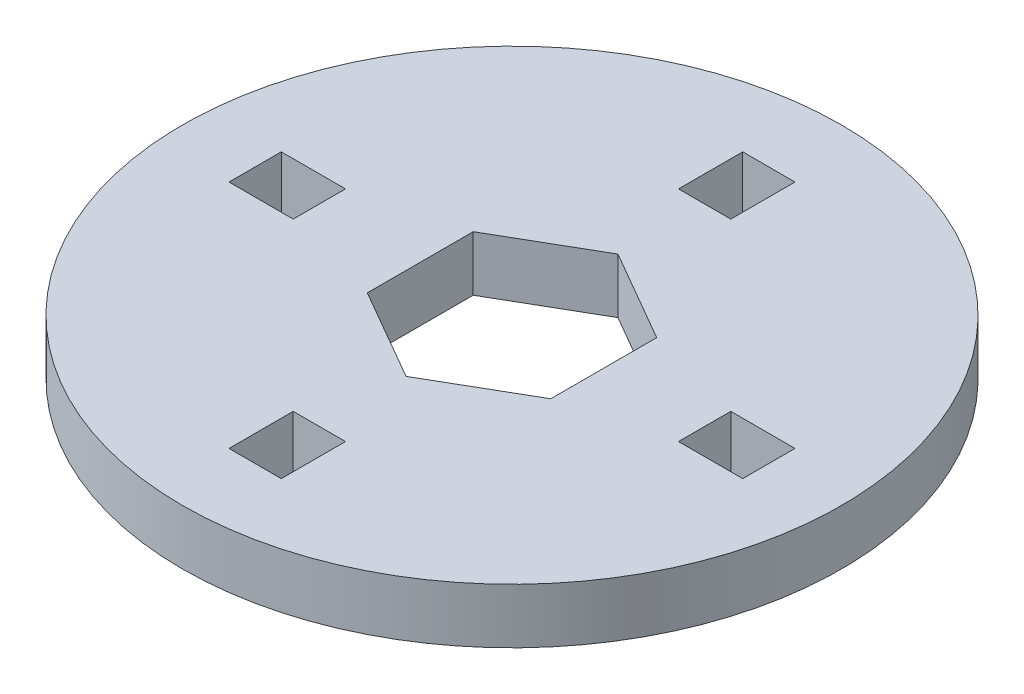
ISO-10303-21;
HEADER;
FILE_DESCRIPTION(('STEP AP214'),'2;1');
FILE_NAME('part.step','',(''),(''),'','','');
FILE_SCHEMA(('AUTOMOTIVE_DESIGN { 1 0 10303 214 1 1 1 1 }'));
ENDSEC;
DATA;
#1=APPLICATION_CONTEXT('core data for automotive mechanical design processes');
#2=APPLICATION_PROTOCOL_DEFINITION('international standard','automotive_design',2000,#1);
#3=PRODUCT_CONTEXT('',#1,'mechanical');
#4=PRODUCT('Part','Part','',(#3));
#5=PRODUCT_RELATED_PRODUCT_CATEGORY('part','',(#4));
#6=PRODUCT_DEFINITION_FORMATION('','',#4);
#7=PRODUCT_DEFINITION_CONTEXT('part definition',#1,'design');
#8=PRODUCT_DEFINITION('design','',#6,#7);
#9=PRODUCT_DEFINITION_SHAPE('','',#8);
#10=(LENGTH_UNIT() NAMED_UNIT(*) SI_UNIT(.MILLI.,.METRE.));
#11=(NAMED_UNIT(*) PLANE_ANGLE_UNIT() SI_UNIT($,.RADIAN.));
#12=(NAMED_UNIT(*) SI_UNIT($,.STERADIAN.) SOLID_ANGLE_UNIT());
#13=UNCERTAINTY_MEASURE_WITH_UNIT(LENGTH_MEASURE(1.E-05),#10,'distance_accuracy_value','');
#14=(GEOMETRIC_REPRESENTATION_CONTEXT(3) GLOBAL_UNCERTAINTY_ASSIGNED_CONTEXT((#13)) GLOBAL_UNIT_ASSIGNED_CONTEXT((#10,
#11,#12)) REPRESENTATION_CONTEXT('',''));
#15=CARTESIAN_POINT('',(0.,0.,0.));
#16=DIRECTION('',(0.,0.,1.));
#17=DIRECTION('',(1.,0.,0.));
#18=AXIS2_PLACEMENT_3D('',#15,#16,#17);
#19=CARTESIAN_POINT('',(0.,3.,0.));
#20=DIRECTION('',(0.,1.,0.));
#21=DIRECTION('',(0.,0.,1.));
#22=AXIS2_PLACEMENT_3D('',#19,#20,#21);
#23=PLANE('',#22);
#24=CARTESIAN_POINT('',(0.,3.,0.));
#25=DIRECTION('',(0.,1.,0.));
#26=DIRECTION('',(0.,0.,1.));
#27=AXIS2_PLACEMENT_3D('',#24,#25,#26);
#28=CIRCLE('',#27,17.9627392120467);
#29=CARTESIAN_POINT('',(0.,3.,17.9627392120467));
#30=VERTEX_POINT('',#29);
#31=EDGE_CURVE('E11',#30,#30,#28,.T.);
#32=ORIENTED_EDGE('',*,*,#31,.T.);
#33=EDGE_LOOP('',(#32));
#34=FACE_BOUND('',#33,.T.);
#35=DIRECTION('',(1.,0.,0.));
#36=VECTOR('',#35,1.);
#37=CARTESIAN_POINT('',(-10.5,3.,1.425));
#38=LINE('',#37,#36);
#39=CARTESIAN_POINT('',(-14.,3.,1.425));
#40=VERTEX_POINT('',#39);
#41=CARTESIAN_POINT('',(-10.5,3.,1.425));
#42=VERTEX_POINT('',#41);
#43=EDGE_CURVE('E328',#40,#42,#38,.T.);
#44=ORIENTED_EDGE('',*,*,#43,.F.);
#45=DIRECTION('',(0.,0.,1.));
#46=VECTOR('',#45,1.);
#47=CARTESIAN_POINT('',(-14.,3.,1.425));
#48=LINE('',#47,#46);
#49=CARTESIAN_POINT('',(-14.,3.,-1.425));
#50=VERTEX_POINT('',#49);
#51=EDGE_CURVE('E326',#50,#40,#48,.T.);
#52=ORIENTED_EDGE('',*,*,#51,.F.);
#53=DIRECTION('',(-1.,0.,0.));
#54=VECTOR('',#53,1.);
#55=CARTESIAN_POINT('',(-10.5,3.,-1.425));
#56=LINE('',#55,#54);
#57=CARTESIAN_POINT('',(-10.5,3.,-1.425));
#58=VERTEX_POINT('',#57);
#59=EDGE_CURVE('E334',#58,#50,#56,.T.);
#60=ORIENTED_EDGE('',*,*,#59,.F.);
#61=DIRECTION('',(0.,0.,-1.));
#62=VECTOR('',#61,1.);
#63=CARTESIAN_POINT('',(-10.5,3.,1.425));
#64=LINE('',#63,#62);
#65=EDGE_CURVE('E331',#42,#58,#64,.T.);
#66=ORIENTED_EDGE('',*,*,#65,.F.);
#67=EDGE_LOOP('',(#44,#52,#60,#66));
#68=FACE_BOUND('',#67,.T.);
#69=DIRECTION('',(0.,0.,1.));
#70=VECTOR('',#69,1.);
#71=CARTESIAN_POINT('',(-1.425,3.,-10.5));
#72=LINE('',#71,#70);
#73=CARTESIAN_POINT('',(-1.425,3.,-14.));
#74=VERTEX_POINT('',#73);
#75=CARTESIAN_POINT('',(-1.425,3.,-10.5));
#76=VERTEX_POINT('',#75);
#77=EDGE_CURVE('E297',#74,#76,#72,.T.);
#78=ORIENTED_EDGE('',*,*,#77,.F.);
#79=DIRECTION('',(-1.,0.,0.));
#80=VECTOR('',#79,1.);
#81=CARTESIAN_POINT('',(-1.425,3.,-14.));
#82=LINE('',#81,#80);
#83=CARTESIAN_POINT('',(1.425,3.,-14.));
#84=VERTEX_POINT('',#83);
#85=EDGE_CURVE('E295',#84,#74,#82,.T.);
#86=ORIENTED_EDGE('',*,*,#85,.F.);
#87=DIRECTION('',(0.,0.,-1.));
#88=VECTOR('',#87,1.);
#89=CARTESIAN_POINT('',(1.425,3.,-10.5));
#90=LINE('',#89,#88);
#91=CARTESIAN_POINT('',(1.425,3.,-10.5));
#92=VERTEX_POINT('',#91);
#93=EDGE_CURVE('E303',#92,#84,#90,.T.);
#94=ORIENTED_EDGE('',*,*,#93,.F.);
#95=DIRECTION('',(1.,0.,0.));
#96=VECTOR('',#95,1.);
#97=CARTESIAN_POINT('',(-1.425,3.,-10.5));
#98=LINE('',#97,#96);
#99=EDGE_CURVE('E300',#76,#92,#98,.T.);
#100=ORIENTED_EDGE('',*,*,#99,.F.);
#101=EDGE_LOOP('',(#78,#86,#94,#100));
#102=FACE_BOUND('',#101,.T.);
#103=DIRECTION('',(1.,0.,0.));
#104=VECTOR('',#103,1.);
#105=CARTESIAN_POINT('',(1.425,3.,14.));
#106=LINE('',#105,#104);
#107=CARTESIAN_POINT('',(-1.425,3.,14.));
#108=VERTEX_POINT('',#107);
#109=CARTESIAN_POINT('',(1.425,3.,14.));
#110=VERTEX_POINT('',#109);
#111=EDGE_CURVE('E266',#108,#110,#106,.T.);
#112=ORIENTED_EDGE('',*,*,#111,.F.);
#113=DIRECTION('',(0.,0.,1.));
#114=VECTOR('',#113,1.);
#115=CARTESIAN_POINT('',(-1.425,3.,10.5));
#116=LINE('',#115,#114);
#117=CARTESIAN_POINT('',(-1.425,3.,10.5));
#118=VERTEX_POINT('',#117);
#119=EDGE_CURVE('E264',#118,#108,#116,.T.);
#120=ORIENTED_EDGE('',*,*,#119,.F.);
#121=DIRECTION('',(-1.,0.,0.));
#122=VECTOR('',#121,1.);
#123=CARTESIAN_POINT('',(1.425,3.,10.5));
#124=LINE('',#123,#122);
#125=CARTESIAN_POINT('',(1.425,3.,10.5));
#126=VERTEX_POINT('',#125);
#127=EDGE_CURVE('E272',#126,#118,#124,.T.);
#128=ORIENTED_EDGE('',*,*,#127,.F.);
#129=DIRECTION('',(0.,0.,-1.));
#130=VECTOR('',#129,1.);
#131=CARTESIAN_POINT('',(1.425,3.,10.5));
#132=LINE('',#131,#130);
#133=EDGE_CURVE('E269',#110,#126,#132,.T.);
#134=ORIENTED_EDGE('',*,*,#133,.F.);
#135=EDGE_LOOP('',(#112,#120,#128,#134));
#136=FACE_BOUND('',#135,.T.);
#137=DIRECTION('',(-1.,0.,0.));
#138=VECTOR('',#137,1.);
#139=CARTESIAN_POINT('',(10.5,3.,-1.425));
#140=LINE('',#139,#138);
#141=CARTESIAN_POINT('',(14.,3.,-1.425));
#142=VERTEX_POINT('',#141);
#143=CARTESIAN_POINT('',(10.5,3.,-1.425));
#144=VERTEX_POINT('',#143);
#145=EDGE_CURVE('E235',#142,#144,#140,.T.);
#146=ORIENTED_EDGE('',*,*,#145,.F.);
#147=DIRECTION('',(0.,0.,-1.));
#148=VECTOR('',#147,1.);
#149=CARTESIAN_POINT('',(14.,3.,-1.425));
#150=LINE('',#149,#148);
#151=CARTESIAN_POINT('',(14.,3.,1.425));
#152=VERTEX_POINT('',#151);
#153=EDGE_CURVE('E233',#152,#142,#150,.T.);
#154=ORIENTED_EDGE('',*,*,#153,.F.);
#155=DIRECTION('',(1.,0.,0.));
#156=VECTOR('',#155,1.);
#157=CARTESIAN_POINT('',(10.5,3.,1.425));
#158=LINE('',#157,#156);
#159=CARTESIAN_POINT('',(10.5,3.,1.425));
#160=VERTEX_POINT('',#159);
#161=EDGE_CURVE('E241',#160,#152,#158,.T.);
#162=ORIENTED_EDGE('',*,*,#161,.F.);
#163=DIRECTION('',(0.,0.,1.));
#164=VECTOR('',#163,1.);
#165=CARTESIAN_POINT('',(10.5,3.,-1.425));
#166=LINE('',#165,#164);
#167=EDGE_CURVE('E238',#144,#160,#166,.T.);
#168=ORIENTED_EDGE('',*,*,#167,.F.);
#169=EDGE_LOOP('',(#146,#154,#162,#168));
#170=FACE_BOUND('',#169,.T.);
#171=DIRECTION('',(0.866025403784439,0.,-0.5));
#172=VECTOR('',#171,1.);
#173=CARTESIAN_POINT('',(0.,3.,5.77350269189626));
#174=LINE('',#173,#172);
#175=CARTESIAN_POINT('',(0.,3.,5.77350269189626));
#176=VERTEX_POINT('',#175);
#177=CARTESIAN_POINT('',(5.,3.,2.88675134594813));
#178=VERTEX_POINT('',#177);
#179=EDGE_CURVE('E190',#176,#178,#174,.T.);
#180=ORIENTED_EDGE('',*,*,#179,.F.);
#181=DIRECTION('',(0.866025403784439,0.,0.5));
#182=VECTOR('',#181,1.);
#183=CARTESIAN_POINT('',(-5.,3.,2.88675134594813));
#184=LINE('',#183,#182);
#185=CARTESIAN_POINT('',(-5.,3.,2.88675134594813));
#186=VERTEX_POINT('',#185);
#187=EDGE_CURVE('E182',#186,#176,#184,.T.);
#188=ORIENTED_EDGE('',*,*,#187,.F.);
#189=DIRECTION('',(0.,0.,1.));
#190=VECTOR('',#189,1.);
#191=CARTESIAN_POINT('',(-5.,3.,-2.88675134594813));
#192=LINE('',#191,#190);
#193=CARTESIAN_POINT('',(-5.,3.,-2.88675134594813));
#194=VERTEX_POINT('',#193);
#195=EDGE_CURVE('E211',#194,#186,#192,.T.);
#196=ORIENTED_EDGE('',*,*,#195,.F.);
#197=DIRECTION('',(-0.866025403784438,0.,0.5));
#198=VECTOR('',#197,1.);
#199=CARTESIAN_POINT('',(0.,3.,-5.77350269189626));
#200=LINE('',#199,#198);
#201=CARTESIAN_POINT('',(0.,3.,-5.77350269189626));
#202=VERTEX_POINT('',#201);
#203=EDGE_CURVE('E209',#202,#194,#200,.T.);
#204=ORIENTED_EDGE('',*,*,#203,.F.);
#205=DIRECTION('',(-0.866025403784439,0.,-0.5));
#206=VECTOR('',#205,1.);
#207=CARTESIAN_POINT('',(5.,3.,-2.88675134594813));
#208=LINE('',#207,#206);
#209=CARTESIAN_POINT('',(5.,3.,-2.88675134594813));
#210=VERTEX_POINT('',#209);
#211=EDGE_CURVE('E205',#210,#202,#208,.T.);
#212=ORIENTED_EDGE('',*,*,#211,.F.);
#213=DIRECTION('',(0.,0.,-1.));
#214=VECTOR('',#213,1.);
#215=CARTESIAN_POINT('',(5.,3.,2.88675134594813));
#216=LINE('',#215,#214);
#217=EDGE_CURVE('E203',#178,#210,#216,.T.);
#218=ORIENTED_EDGE('',*,*,#217,.F.);
#219=EDGE_LOOP('',(#180,#188,#196,#204,#212,#218));
#220=FACE_BOUND('',#219,.T.);
#221=ADVANCED_FACE('F33',(#34,#68,#102,#136,#170,#220),#23,.T.);
#222=CARTESIAN_POINT('',(0.,0.,0.));
#223=DIRECTION('',(0.,1.,0.));
#224=DIRECTION('',(0.,0.,1.));
#225=AXIS2_PLACEMENT_3D('',#222,#223,#224);
#226=PLANE('',#225);
#227=DIRECTION('',(0.,0.,-1.));
#228=VECTOR('',#227,1.);
#229=CARTESIAN_POINT('',(14.,0.,-1.425));
#230=LINE('',#229,#228);
#231=CARTESIAN_POINT('',(14.,0.,1.425));
#232=VERTEX_POINT('',#231);
#233=CARTESIAN_POINT('',(14.,0.,-1.425));
#234=VERTEX_POINT('',#233);
#235=EDGE_CURVE('E198',#232,#234,#230,.T.);
#236=ORIENTED_EDGE('',*,*,#235,.T.);
#237=DIRECTION('',(-1.,0.,0.));
#238=VECTOR('',#237,1.);
#239=CARTESIAN_POINT('',(10.5,0.,-1.425));
#240=LINE('',#239,#238);
#241=CARTESIAN_POINT('',(10.5,0.,-1.425));
#242=VERTEX_POINT('',#241);
#243=EDGE_CURVE('E246',#234,#242,#240,.T.);
#244=ORIENTED_EDGE('',*,*,#243,.T.);
#245=DIRECTION('',(0.,0.,1.));
#246=VECTOR('',#245,1.);
#247=CARTESIAN_POINT('',(10.5,0.,-1.425));
#248=LINE('',#247,#246);
#249=CARTESIAN_POINT('',(10.5,0.,1.425));
#250=VERTEX_POINT('',#249);
#251=EDGE_CURVE('E249',#242,#250,#248,.T.);
#252=ORIENTED_EDGE('',*,*,#251,.T.);
#253=DIRECTION('',(1.,0.,0.));
#254=VECTOR('',#253,1.);
#255=CARTESIAN_POINT('',(10.5,0.,1.425));
#256=LINE('',#255,#254);
#257=EDGE_CURVE('E236',#250,#232,#256,.T.);
#258=ORIENTED_EDGE('',*,*,#257,.T.);
#259=EDGE_LOOP('',(#236,#244,#252,#258));
#260=FACE_BOUND('',#259,.T.);
#261=DIRECTION('',(-1.,0.,0.));
#262=VECTOR('',#261,1.);
#263=CARTESIAN_POINT('',(-1.425,0.,-14.));
#264=LINE('',#263,#262);
#265=CARTESIAN_POINT('',(1.425,0.,-14.));
#266=VERTEX_POINT('',#265);
#267=CARTESIAN_POINT('',(-1.425,0.,-14.));
#268=VERTEX_POINT('',#267);
#269=EDGE_CURVE('E294',#266,#268,#264,.T.);
#270=ORIENTED_EDGE('',*,*,#269,.T.);
#271=DIRECTION('',(0.,0.,1.));
#272=VECTOR('',#271,1.);
#273=CARTESIAN_POINT('',(-1.425,0.,-10.5));
#274=LINE('',#273,#272);
#275=CARTESIAN_POINT('',(-1.425,0.,-10.5));
#276=VERTEX_POINT('',#275);
#277=EDGE_CURVE('E308',#268,#276,#274,.T.);
#278=ORIENTED_EDGE('',*,*,#277,.T.);
#279=DIRECTION('',(1.,0.,0.));
#280=VECTOR('',#279,1.);
#281=CARTESIAN_POINT('',(-1.425,0.,-10.5));
#282=LINE('',#281,#280);
#283=CARTESIAN_POINT('',(1.425,0.,-10.5));
#284=VERTEX_POINT('',#283);
#285=EDGE_CURVE('E311',#276,#284,#282,.T.);
#286=ORIENTED_EDGE('',*,*,#285,.T.);
#287=DIRECTION('',(0.,0.,-1.));
#288=VECTOR('',#287,1.);
#289=CARTESIAN_POINT('',(1.425,0.,-10.5));
#290=LINE('',#289,#288);
#291=EDGE_CURVE('E298',#284,#266,#290,.T.);
#292=ORIENTED_EDGE('',*,*,#291,.T.);
#293=EDGE_LOOP('',(#270,#278,#286,#292));
#294=FACE_BOUND('',#293,.T.);
#295=CARTESIAN_POINT('',(0.,0.,0.));
#296=DIRECTION('',(0.,1.,0.));
#297=DIRECTION('',(0.,0.,1.));
#298=AXIS2_PLACEMENT_3D('',#295,#296,#297);
#299=CIRCLE('',#298,17.9627392120467);
#300=CARTESIAN_POINT('',(0.,0.,17.9627392120467));
#301=VERTEX_POINT('',#300);
#302=EDGE_CURVE('E37',#301,#301,#299,.T.);
#303=ORIENTED_EDGE('',*,*,#302,.F.);
#304=EDGE_LOOP('',(#303));
#305=FACE_BOUND('',#304,.T.);
#306=DIRECTION('',(0.,0.,1.));
#307=VECTOR('',#306,1.);
#308=CARTESIAN_POINT('',(-14.,0.,1.425));
#309=LINE('',#308,#307);
#310=CARTESIAN_POINT('',(-14.,0.,-1.425));
#311=VERTEX_POINT('',#310);
#312=CARTESIAN_POINT('',(-14.,0.,1.425));
#313=VERTEX_POINT('',#312);
#314=EDGE_CURVE('E325',#311,#313,#309,.T.);
#315=ORIENTED_EDGE('',*,*,#314,.T.);
#316=DIRECTION('',(1.,0.,0.));
#317=VECTOR('',#316,1.);
#318=CARTESIAN_POINT('',(-10.5,0.,1.425));
#319=LINE('',#318,#317);
#320=CARTESIAN_POINT('',(-10.5,0.,1.425));
#321=VERTEX_POINT('',#320);
#322=EDGE_CURVE('E339',#313,#321,#319,.T.);
#323=ORIENTED_EDGE('',*,*,#322,.T.);
#324=DIRECTION('',(0.,0.,-1.));
#325=VECTOR('',#324,1.);
#326=CARTESIAN_POINT('',(-10.5,0.,1.425));
#327=LINE('',#326,#325);
#328=CARTESIAN_POINT('',(-10.5,0.,-1.425));
#329=VERTEX_POINT('',#328);
#330=EDGE_CURVE('E342',#321,#329,#327,.T.);
#331=ORIENTED_EDGE('',*,*,#330,.T.);
#332=DIRECTION('',(-1.,0.,0.));
#333=VECTOR('',#332,1.);
#334=CARTESIAN_POINT('',(-10.5,0.,-1.425));
#335=LINE('',#334,#333);
#336=EDGE_CURVE('E329',#329,#311,#335,.T.);
#337=ORIENTED_EDGE('',*,*,#336,.T.);
#338=EDGE_LOOP('',(#315,#323,#331,#337));
#339=FACE_BOUND('',#338,.T.);
#340=DIRECTION('',(0.,0.,1.));
#341=VECTOR('',#340,1.);
#342=CARTESIAN_POINT('',(-1.425,0.,10.5));
#343=LINE('',#342,#341);
#344=CARTESIAN_POINT('',(-1.425,0.,10.5));
#345=VERTEX_POINT('',#344);
#346=CARTESIAN_POINT('',(-1.425,0.,14.));
#347=VERTEX_POINT('',#346);
#348=EDGE_CURVE('E263',#345,#347,#343,.T.);
#349=ORIENTED_EDGE('',*,*,#348,.T.);
#350=DIRECTION('',(1.,0.,0.));
#351=VECTOR('',#350,1.);
#352=CARTESIAN_POINT('',(1.425,0.,14.));
#353=LINE('',#352,#351);
#354=CARTESIAN_POINT('',(1.425,0.,14.));
#355=VERTEX_POINT('',#354);
#356=EDGE_CURVE('E277',#347,#355,#353,.T.);
#357=ORIENTED_EDGE('',*,*,#356,.T.);
#358=DIRECTION('',(0.,0.,-1.));
#359=VECTOR('',#358,1.);
#360=CARTESIAN_POINT('',(1.425,0.,10.5));
#361=LINE('',#360,#359);
#362=CARTESIAN_POINT('',(1.425,0.,10.5));
#363=VERTEX_POINT('',#362);
#364=EDGE_CURVE('E280',#355,#363,#361,.T.);
#365=ORIENTED_EDGE('',*,*,#364,.T.);
#366=DIRECTION('',(-1.,0.,0.));
#367=VECTOR('',#366,1.);
#368=CARTESIAN_POINT('',(1.425,0.,10.5));
#369=LINE('',#368,#367);
#370=EDGE_CURVE('E267',#363,#345,#369,.T.);
#371=ORIENTED_EDGE('',*,*,#370,.T.);
#372=EDGE_LOOP('',(#349,#357,#365,#371));
#373=FACE_BOUND('',#372,.T.);
#374=DIRECTION('',(0.866025403784439,0.,0.5));
#375=VECTOR('',#374,1.);
#376=CARTESIAN_POINT('',(-5.,0.,2.88675134594813));
#377=LINE('',#376,#375);
#378=CARTESIAN_POINT('',(-5.,0.,2.88675134594813));
#379=VERTEX_POINT('',#378);
#380=CARTESIAN_POINT('',(0.,0.,5.77350269189626));
#381=VERTEX_POINT('',#380);
#382=EDGE_CURVE('E56',#379,#381,#377,.T.);
#383=ORIENTED_EDGE('',*,*,#382,.T.);
#384=DIRECTION('',(0.866025403784439,0.,-0.5));
#385=VECTOR('',#384,1.);
#386=CARTESIAN_POINT('',(0.,0.,5.77350269189626));
#387=LINE('',#386,#385);
#388=CARTESIAN_POINT('',(5.,0.,2.88675134594813));
#389=VERTEX_POINT('',#388);
#390=EDGE_CURVE('E197',#381,#389,#387,.T.);
#391=ORIENTED_EDGE('',*,*,#390,.T.);
#392=DIRECTION('',(0.,0.,-1.));
#393=VECTOR('',#392,1.);
#394=CARTESIAN_POINT('',(5.,0.,2.88675134594813));
#395=LINE('',#394,#393);
#396=CARTESIAN_POINT('',(5.,0.,-2.88675134594813));
#397=VERTEX_POINT('',#396);
#398=EDGE_CURVE('E215',#389,#397,#395,.T.);
#399=ORIENTED_EDGE('',*,*,#398,.T.);
#400=DIRECTION('',(-0.866025403784439,0.,-0.5));
#401=VECTOR('',#400,1.);
#402=CARTESIAN_POINT('',(5.,0.,-2.88675134594813));
#403=LINE('',#402,#401);
#404=CARTESIAN_POINT('',(0.,0.,-5.77350269189626));
#405=VERTEX_POINT('',#404);
#406=EDGE_CURVE('E218',#397,#405,#403,.T.);
#407=ORIENTED_EDGE('',*,*,#406,.T.);
#408=DIRECTION('',(-0.866025403784438,0.,0.5));
#409=VECTOR('',#408,1.);
#410=CARTESIAN_POINT('',(0.,0.,-5.77350269189626));
#411=LINE('',#410,#409);
#412=CARTESIAN_POINT('',(-5.,0.,-2.88675134594813));
#413=VERTEX_POINT('',#412);
#414=EDGE_CURVE('E221',#405,#413,#411,.T.);
#415=ORIENTED_EDGE('',*,*,#414,.T.);
#416=DIRECTION('',(0.,0.,1.));
#417=VECTOR('',#416,1.);
#418=CARTESIAN_POINT('',(-5.,0.,-2.88675134594813));
#419=LINE('',#418,#417);
#420=EDGE_CURVE('E191',#413,#379,#419,.T.);
#421=ORIENTED_EDGE('',*,*,#420,.T.);
#422=EDGE_LOOP('',(#383,#391,#399,#407,#415,#421));
#423=FACE_BOUND('',#422,.T.);
#424=ADVANCED_FACE('F361',(#260,#294,#305,#339,#373,#423),#226,.F.);
#425=CARTESIAN_POINT('',(0.,3.,0.));
#426=DIRECTION('',(0.,-1.,0.));
#427=DIRECTION('',(0.,0.,-1.));
#428=AXIS2_PLACEMENT_3D('',#425,#426,#427);
#429=CYLINDRICAL_SURFACE('',#428,17.9627392120467);
#430=ORIENTED_EDGE('',*,*,#31,.F.);
#431=EDGE_LOOP('',(#430));
#432=FACE_BOUND('',#431,.T.);
#433=ORIENTED_EDGE('',*,*,#302,.T.);
#434=EDGE_LOOP('',(#433));
#435=FACE_BOUND('',#434,.T.);
#436=ADVANCED_FACE('F35',(#432,#435),#429,.T.);
#437=CARTESIAN_POINT('',(-14.,3.,1.425));
#438=DIRECTION('',(1.,0.,0.));
#439=DIRECTION('',(0.,0.,-1.));
#440=AXIS2_PLACEMENT_3D('',#437,#438,#439);
#441=PLANE('',#440);
#442=ORIENTED_EDGE('',*,*,#314,.F.);
#443=DIRECTION('',(0.,-1.,0.));
#444=VECTOR('',#443,1.);
#445=CARTESIAN_POINT('',(-14.,3.,-1.425));
#446=LINE('',#445,#444);
#447=EDGE_CURVE('E336',#50,#311,#446,.T.);
#448=ORIENTED_EDGE('',*,*,#447,.F.);
#449=ORIENTED_EDGE('',*,*,#51,.T.);
#450=DIRECTION('',(0.,-1.,0.));
#451=VECTOR('',#450,1.);
#452=CARTESIAN_POINT('',(-14.,3.,1.425));
#453=LINE('',#452,#451);
#454=EDGE_CURVE('E353',#40,#313,#453,.T.);
#455=ORIENTED_EDGE('',*,*,#454,.T.);
#456=EDGE_LOOP('',(#442,#448,#449,#455));
#457=FACE_BOUND('',#456,.T.);
#458=ADVANCED_FACE('F395',(#457),#441,.T.);
#459=CARTESIAN_POINT('',(-10.5,3.,1.425));
#460=DIRECTION('',(0.,0.,-1.));
#461=DIRECTION('',(-1.,0.,0.));
#462=AXIS2_PLACEMENT_3D('',#459,#460,#461);
#463=PLANE('',#462);
#464=ORIENTED_EDGE('',*,*,#322,.F.);
#465=ORIENTED_EDGE('',*,*,#454,.F.);
#466=ORIENTED_EDGE('',*,*,#43,.T.);
#467=DIRECTION('',(0.,-1.,0.));
#468=VECTOR('',#467,1.);
#469=CARTESIAN_POINT('',(-10.5,3.,1.425));
#470=LINE('',#469,#468);
#471=EDGE_CURVE('E351',#42,#321,#470,.T.);
#472=ORIENTED_EDGE('',*,*,#471,.T.);
#473=EDGE_LOOP('',(#464,#465,#466,#472));
#474=FACE_BOUND('',#473,.T.);
#475=ADVANCED_FACE('F398',(#474),#463,.T.);
#476=CARTESIAN_POINT('',(-10.5,3.,1.425));
#477=DIRECTION('',(-1.,0.,0.));
#478=DIRECTION('',(0.,0.,1.));
#479=AXIS2_PLACEMENT_3D('',#476,#477,#478);
#480=PLANE('',#479);
#481=ORIENTED_EDGE('',*,*,#330,.F.);
#482=ORIENTED_EDGE('',*,*,#471,.F.);
#483=ORIENTED_EDGE('',*,*,#65,.T.);
#484=DIRECTION('',(0.,-1.,0.));
#485=VECTOR('',#484,1.);
#486=CARTESIAN_POINT('',(-10.5,3.,-1.425));
#487=LINE('',#486,#485);
#488=EDGE_CURVE('E349',#58,#329,#487,.T.);
#489=ORIENTED_EDGE('',*,*,#488,.T.);
#490=EDGE_LOOP('',(#481,#482,#483,#489));
#491=FACE_BOUND('',#490,.T.);
#492=ADVANCED_FACE('F401',(#491),#480,.T.);
#493=CARTESIAN_POINT('',(-10.5,3.,-1.425));
#494=DIRECTION('',(0.,0.,1.));
#495=DIRECTION('',(1.,0.,0.));
#496=AXIS2_PLACEMENT_3D('',#493,#494,#495);
#497=PLANE('',#496);
#498=ORIENTED_EDGE('',*,*,#336,.F.);
#499=ORIENTED_EDGE('',*,*,#488,.F.);
#500=ORIENTED_EDGE('',*,*,#59,.T.);
#501=ORIENTED_EDGE('',*,*,#447,.T.);
#502=EDGE_LOOP('',(#498,#499,#500,#501));
#503=FACE_BOUND('',#502,.T.);
#504=ADVANCED_FACE('F405',(#503),#497,.T.);
#505=CARTESIAN_POINT('',(-1.425,3.,-14.));
#506=DIRECTION('',(0.,0.,1.));
#507=DIRECTION('',(1.,0.,0.));
#508=AXIS2_PLACEMENT_3D('',#505,#506,#507);
#509=PLANE('',#508);
#510=ORIENTED_EDGE('',*,*,#269,.F.);
#511=DIRECTION('',(0.,-1.,0.));
#512=VECTOR('',#511,1.);
#513=CARTESIAN_POINT('',(1.425,3.,-14.));
#514=LINE('',#513,#512);
#515=EDGE_CURVE('E305',#84,#266,#514,.T.);
#516=ORIENTED_EDGE('',*,*,#515,.F.);
#517=ORIENTED_EDGE('',*,*,#85,.T.);
#518=DIRECTION('',(0.,-1.,0.));
#519=VECTOR('',#518,1.);
#520=CARTESIAN_POINT('',(-1.425,3.,-14.));
#521=LINE('',#520,#519);
#522=EDGE_CURVE('E322',#74,#268,#521,.T.);
#523=ORIENTED_EDGE('',*,*,#522,.T.);
#524=EDGE_LOOP('',(#510,#516,#517,#523));
#525=FACE_BOUND('',#524,.T.);
#526=ADVANCED_FACE('F409',(#525),#509,.T.);
#527=CARTESIAN_POINT('',(-1.425,3.,-10.5));
#528=DIRECTION('',(1.,0.,0.));
#529=DIRECTION('',(0.,0.,-1.));
#530=AXIS2_PLACEMENT_3D('',#527,#528,#529);
#531=PLANE('',#530);
#532=ORIENTED_EDGE('',*,*,#277,.F.);
#533=ORIENTED_EDGE('',*,*,#522,.F.);
#534=ORIENTED_EDGE('',*,*,#77,.T.);
#535=DIRECTION('',(0.,-1.,0.));
#536=VECTOR('',#535,1.);
#537=CARTESIAN_POINT('',(-1.425,3.,-10.5));
#538=LINE('',#537,#536);
#539=EDGE_CURVE('E320',#76,#276,#538,.T.);
#540=ORIENTED_EDGE('',*,*,#539,.T.);
#541=EDGE_LOOP('',(#532,#533,#534,#540));
#542=FACE_BOUND('',#541,.T.);
#543=ADVANCED_FACE('F413',(#542),#531,.T.);
#544=CARTESIAN_POINT('',(-1.425,3.,-10.5));
#545=DIRECTION('',(0.,0.,-1.));
#546=DIRECTION('',(-1.,0.,0.));
#547=AXIS2_PLACEMENT_3D('',#544,#545,#546);
#548=PLANE('',#547);
#549=ORIENTED_EDGE('',*,*,#285,.F.);
#550=ORIENTED_EDGE('',*,*,#539,.F.);
#551=ORIENTED_EDGE('',*,*,#99,.T.);
#552=DIRECTION('',(0.,-1.,0.));
#553=VECTOR('',#552,1.);
#554=CARTESIAN_POINT('',(1.425,3.,-10.5));
#555=LINE('',#554,#553);
#556=EDGE_CURVE('E318',#92,#284,#555,.T.);
#557=ORIENTED_EDGE('',*,*,#556,.T.);
#558=EDGE_LOOP('',(#549,#550,#551,#557));
#559=FACE_BOUND('',#558,.T.);
#560=ADVANCED_FACE('F417',(#559),#548,.T.);
#561=CARTESIAN_POINT('',(1.425,3.,-10.5));
#562=DIRECTION('',(-1.,0.,0.));
#563=DIRECTION('',(0.,0.,1.));
#564=AXIS2_PLACEMENT_3D('',#561,#562,#563);
#565=PLANE('',#564);
#566=ORIENTED_EDGE('',*,*,#291,.F.);
#567=ORIENTED_EDGE('',*,*,#556,.F.);
#568=ORIENTED_EDGE('',*,*,#93,.T.);
#569=ORIENTED_EDGE('',*,*,#515,.T.);
#570=EDGE_LOOP('',(#566,#567,#568,#569));
#571=FACE_BOUND('',#570,.T.);
#572=ADVANCED_FACE('F421',(#571),#565,.T.);
#573=CARTESIAN_POINT('',(-1.425,3.,10.5));
#574=DIRECTION('',(1.,0.,0.));
#575=DIRECTION('',(0.,0.,-1.));
#576=AXIS2_PLACEMENT_3D('',#573,#574,#575);
#577=PLANE('',#576);
#578=ORIENTED_EDGE('',*,*,#348,.F.);
#579=DIRECTION('',(0.,-1.,0.));
#580=VECTOR('',#579,1.);
#581=CARTESIAN_POINT('',(-1.425,3.,10.5));
#582=LINE('',#581,#580);
#583=EDGE_CURVE('E274',#118,#345,#582,.T.);
#584=ORIENTED_EDGE('',*,*,#583,.F.);
#585=ORIENTED_EDGE('',*,*,#119,.T.);
#586=DIRECTION('',(0.,-1.,0.));
#587=VECTOR('',#586,1.);
#588=CARTESIAN_POINT('',(-1.425,3.,14.));
#589=LINE('',#588,#587);
#590=EDGE_CURVE('E291',#108,#347,#589,.T.);
#591=ORIENTED_EDGE('',*,*,#590,.T.);
#592=EDGE_LOOP('',(#578,#584,#585,#591));
#593=FACE_BOUND('',#592,.T.);
#594=ADVANCED_FACE('F425',(#593),#577,.T.);
#595=CARTESIAN_POINT('',(1.425,3.,14.));
#596=DIRECTION('',(0.,0.,-1.));
#597=DIRECTION('',(-1.,0.,0.));
#598=AXIS2_PLACEMENT_3D('',#595,#596,#597);
#599=PLANE('',#598);
#600=ORIENTED_EDGE('',*,*,#356,.F.);
#601=ORIENTED_EDGE('',*,*,#590,.F.);
#602=ORIENTED_EDGE('',*,*,#111,.T.);
#603=DIRECTION('',(0.,-1.,0.));
#604=VECTOR('',#603,1.);
#605=CARTESIAN_POINT('',(1.425,3.,14.));
#606=LINE('',#605,#604);
#607=EDGE_CURVE('E289',#110,#355,#606,.T.);
#608=ORIENTED_EDGE('',*,*,#607,.T.);
#609=EDGE_LOOP('',(#600,#601,#602,#608));
#610=FACE_BOUND('',#609,.T.);
#611=ADVANCED_FACE('F429',(#610),#599,.T.);
#612=CARTESIAN_POINT('',(1.425,3.,10.5));
#613=DIRECTION('',(-1.,0.,0.));
#614=DIRECTION('',(0.,0.,1.));
#615=AXIS2_PLACEMENT_3D('',#612,#613,#614);
#616=PLANE('',#615);
#617=ORIENTED_EDGE('',*,*,#364,.F.);
#618=ORIENTED_EDGE('',*,*,#607,.F.);
#619=ORIENTED_EDGE('',*,*,#133,.T.);
#620=DIRECTION('',(0.,-1.,0.));
#621=VECTOR('',#620,1.);
#622=CARTESIAN_POINT('',(1.425,3.,10.5));
#623=LINE('',#622,#621);
#624=EDGE_CURVE('E287',#126,#363,#623,.T.);
#625=ORIENTED_EDGE('',*,*,#624,.T.);
#626=EDGE_LOOP('',(#617,#618,#619,#625));
#627=FACE_BOUND('',#626,.T.);
#628=ADVANCED_FACE('F433',(#627),#616,.T.);
#629=CARTESIAN_POINT('',(1.425,3.,10.5));
#630=DIRECTION('',(0.,0.,1.));
#631=DIRECTION('',(1.,0.,0.));
#632=AXIS2_PLACEMENT_3D('',#629,#630,#631);
#633=PLANE('',#632);
#634=ORIENTED_EDGE('',*,*,#370,.F.);
#635=ORIENTED_EDGE('',*,*,#624,.F.);
#636=ORIENTED_EDGE('',*,*,#127,.T.);
#637=ORIENTED_EDGE('',*,*,#583,.T.);
#638=EDGE_LOOP('',(#634,#635,#636,#637));
#639=FACE_BOUND('',#638,.T.);
#640=ADVANCED_FACE('F437',(#639),#633,.T.);
#641=CARTESIAN_POINT('',(14.,3.,-1.425));
#642=DIRECTION('',(-1.,0.,0.));
#643=DIRECTION('',(0.,0.,1.));
#644=AXIS2_PLACEMENT_3D('',#641,#642,#643);
#645=PLANE('',#644);
#646=ORIENTED_EDGE('',*,*,#235,.F.);
#647=DIRECTION('',(0.,-1.,0.));
#648=VECTOR('',#647,1.);
#649=CARTESIAN_POINT('',(14.,3.,1.425));
#650=LINE('',#649,#648);
#651=EDGE_CURVE('E243',#152,#232,#650,.T.);
#652=ORIENTED_EDGE('',*,*,#651,.F.);
#653=ORIENTED_EDGE('',*,*,#153,.T.);
#654=DIRECTION('',(0.,-1.,0.));
#655=VECTOR('',#654,1.);
#656=CARTESIAN_POINT('',(14.,3.,-1.425));
#657=LINE('',#656,#655);
#658=EDGE_CURVE('E260',#142,#234,#657,.T.);
#659=ORIENTED_EDGE('',*,*,#658,.T.);
#660=EDGE_LOOP('',(#646,#652,#653,#659));
#661=FACE_BOUND('',#660,.T.);
#662=ADVANCED_FACE('F441',(#661),#645,.T.);
#663=CARTESIAN_POINT('',(10.5,3.,-1.425));
#664=DIRECTION('',(0.,0.,1.));
#665=DIRECTION('',(1.,0.,0.));
#666=AXIS2_PLACEMENT_3D('',#663,#664,#665);
#667=PLANE('',#666);
#668=ORIENTED_EDGE('',*,*,#243,.F.);
#669=ORIENTED_EDGE('',*,*,#658,.F.);
#670=ORIENTED_EDGE('',*,*,#145,.T.);
#671=DIRECTION('',(0.,-1.,0.));
#672=VECTOR('',#671,1.);
#673=CARTESIAN_POINT('',(10.5,3.,-1.425));
#674=LINE('',#673,#672);
#675=EDGE_CURVE('E258',#144,#242,#674,.T.);
#676=ORIENTED_EDGE('',*,*,#675,.T.);
#677=EDGE_LOOP('',(#668,#669,#670,#676));
#678=FACE_BOUND('',#677,.T.);
#679=ADVANCED_FACE('F445',(#678),#667,.T.);
#680=CARTESIAN_POINT('',(10.5,3.,-1.425));
#681=DIRECTION('',(1.,0.,0.));
#682=DIRECTION('',(0.,0.,-1.));
#683=AXIS2_PLACEMENT_3D('',#680,#681,#682);
#684=PLANE('',#683);
#685=ORIENTED_EDGE('',*,*,#251,.F.);
#686=ORIENTED_EDGE('',*,*,#675,.F.);
#687=ORIENTED_EDGE('',*,*,#167,.T.);
#688=DIRECTION('',(0.,-1.,0.));
#689=VECTOR('',#688,1.);
#690=CARTESIAN_POINT('',(10.5,3.,1.425));
#691=LINE('',#690,#689);
#692=EDGE_CURVE('E256',#160,#250,#691,.T.);
#693=ORIENTED_EDGE('',*,*,#692,.T.);
#694=EDGE_LOOP('',(#685,#686,#687,#693));
#695=FACE_BOUND('',#694,.T.);
#696=ADVANCED_FACE('F449',(#695),#684,.T.);
#697=CARTESIAN_POINT('',(10.5,3.,1.425));
#698=DIRECTION('',(0.,0.,-1.));
#699=DIRECTION('',(-1.,0.,0.));
#700=AXIS2_PLACEMENT_3D('',#697,#698,#699);
#701=PLANE('',#700);
#702=ORIENTED_EDGE('',*,*,#257,.F.);
#703=ORIENTED_EDGE('',*,*,#692,.F.);
#704=ORIENTED_EDGE('',*,*,#161,.T.);
#705=ORIENTED_EDGE('',*,*,#651,.T.);
#706=EDGE_LOOP('',(#702,#703,#704,#705));
#707=FACE_BOUND('',#706,.T.);
#708=ADVANCED_FACE('F453',(#707),#701,.T.);
#709=CARTESIAN_POINT('',(-5.,3.,2.88675134594813));
#710=DIRECTION('',(0.5,0.,-0.866025403784439));
#711=DIRECTION('',(-0.866025403784439,0.,-0.5));
#712=AXIS2_PLACEMENT_3D('',#709,#710,#711);
#713=PLANE('',#712);
#714=ORIENTED_EDGE('',*,*,#382,.F.);
#715=DIRECTION('',(0.,-1.,0.));
#716=VECTOR('',#715,1.);
#717=CARTESIAN_POINT('',(-5.,3.,2.88675134594813));
#718=LINE('',#717,#716);
#719=EDGE_CURVE('E186',#186,#379,#718,.T.);
#720=ORIENTED_EDGE('',*,*,#719,.F.);
#721=ORIENTED_EDGE('',*,*,#187,.T.);
#722=DIRECTION('',(0.,-1.,0.));
#723=VECTOR('',#722,1.);
#724=CARTESIAN_POINT('',(0.,3.,5.77350269189626));
#725=LINE('',#724,#723);
#726=EDGE_CURVE('E185',#176,#381,#725,.T.);
#727=ORIENTED_EDGE('',*,*,#726,.T.);
#728=EDGE_LOOP('',(#714,#720,#721,#727));
#729=FACE_BOUND('',#728,.T.);
#730=ADVANCED_FACE('F184',(#729),#713,.T.);
#731=CARTESIAN_POINT('',(0.,3.,5.77350269189626));
#732=DIRECTION('',(-0.5,0.,-0.866025403784439));
#733=DIRECTION('',(-0.866025403784439,0.,0.5));
#734=AXIS2_PLACEMENT_3D('',#731,#732,#733);
#735=PLANE('',#734);
#736=ORIENTED_EDGE('',*,*,#390,.F.);
#737=ORIENTED_EDGE('',*,*,#726,.F.);
#738=ORIENTED_EDGE('',*,*,#179,.T.);
#739=DIRECTION('',(0.,-1.,0.));
#740=VECTOR('',#739,1.);
#741=CARTESIAN_POINT('',(5.,3.,2.88675134594813));
#742=LINE('',#741,#740);
#743=EDGE_CURVE('E199',#178,#389,#742,.T.);
#744=ORIENTED_EDGE('',*,*,#743,.T.);
#745=EDGE_LOOP('',(#736,#737,#738,#744));
#746=FACE_BOUND('',#745,.T.);
#747=ADVANCED_FACE('F194',(#746),#735,.T.);
#748=CARTESIAN_POINT('',(5.,3.,2.88675134594813));
#749=DIRECTION('',(-1.,0.,0.));
#750=DIRECTION('',(0.,0.,1.));
#751=AXIS2_PLACEMENT_3D('',#748,#749,#750);
#752=PLANE('',#751);
#753=ORIENTED_EDGE('',*,*,#398,.F.);
#754=ORIENTED_EDGE('',*,*,#743,.F.);
#755=ORIENTED_EDGE('',*,*,#217,.T.);
#756=DIRECTION('',(0.,-1.,0.));
#757=VECTOR('',#756,1.);
#758=CARTESIAN_POINT('',(5.,3.,-2.88675134594813));
#759=LINE('',#758,#757);
#760=EDGE_CURVE('E230',#210,#397,#759,.T.);
#761=ORIENTED_EDGE('',*,*,#760,.T.);
#762=EDGE_LOOP('',(#753,#754,#755,#761));
#763=FACE_BOUND('',#762,.T.);
#764=ADVANCED_FACE('F379',(#763),#752,.T.);
#765=CARTESIAN_POINT('',(5.,3.,-2.88675134594813));
#766=DIRECTION('',(-0.5,0.,0.866025403784439));
#767=DIRECTION('',(0.866025403784439,0.,0.5));
#768=AXIS2_PLACEMENT_3D('',#765,#766,#767);
#769=PLANE('',#768);
#770=ORIENTED_EDGE('',*,*,#406,.F.);
#771=ORIENTED_EDGE('',*,*,#760,.F.);
#772=ORIENTED_EDGE('',*,*,#211,.T.);
#773=DIRECTION('',(0.,-1.,0.));
#774=VECTOR('',#773,1.);
#775=CARTESIAN_POINT('',(0.,3.,-5.77350269189626));
#776=LINE('',#775,#774);
#777=EDGE_CURVE('E228',#202,#405,#776,.T.);
#778=ORIENTED_EDGE('',*,*,#777,.T.);
#779=EDGE_LOOP('',(#770,#771,#772,#778));
#780=FACE_BOUND('',#779,.T.);
#781=ADVANCED_FACE('F375',(#780),#769,.T.);
#782=CARTESIAN_POINT('',(0.,3.,-5.77350269189626));
#783=DIRECTION('',(0.5,0.,0.866025403784439));
#784=DIRECTION('',(0.866025403784439,0.,-0.5));
#785=AXIS2_PLACEMENT_3D('',#782,#783,#784);
#786=PLANE('',#785);
#787=ORIENTED_EDGE('',*,*,#414,.F.);
#788=ORIENTED_EDGE('',*,*,#777,.F.);
#789=ORIENTED_EDGE('',*,*,#203,.T.);
#790=DIRECTION('',(0.,-1.,0.));
#791=VECTOR('',#790,1.);
#792=CARTESIAN_POINT('',(-5.,3.,-2.88675134594813));
#793=LINE('',#792,#791);
#794=EDGE_CURVE('E48',#194,#413,#793,.T.);
#795=ORIENTED_EDGE('',*,*,#794,.T.);
#796=EDGE_LOOP('',(#787,#788,#789,#795));
#797=FACE_BOUND('',#796,.T.);
#798=ADVANCED_FACE('F372',(#797),#786,.T.);
#799=CARTESIAN_POINT('',(-5.,3.,-2.88675134594813));
#800=DIRECTION('',(1.,0.,0.));
#801=DIRECTION('',(0.,0.,-1.));
#802=AXIS2_PLACEMENT_3D('',#799,#800,#801);
#803=PLANE('',#802);
#804=ORIENTED_EDGE('',*,*,#420,.F.);
#805=ORIENTED_EDGE('',*,*,#794,.F.);
#806=ORIENTED_EDGE('',*,*,#195,.T.);
#807=ORIENTED_EDGE('',*,*,#719,.T.);
#808=EDGE_LOOP('',(#804,#805,#806,#807));
#809=FACE_BOUND('',#808,.T.);
#810=ADVANCED_FACE('F368',(#809),#803,.T.);
#811=CLOSED_SHELL('',(#221,#424,#436,#458,#475,#492,#504,#526,#543,#560,#572,#594,#611,#628,
#640,#662,#679,#696,#708,#730,#747,#764,#781,#798,#810));
#812=MANIFOLD_SOLID_BREP('B2',#811);
#813=ADVANCED_BREP_SHAPE_REPRESENTATION('',(#18,#812),#14);
#814=SHAPE_DEFINITION_REPRESENTATION(#9,#813);
ENDSEC;
END-ISO-10303-21;
